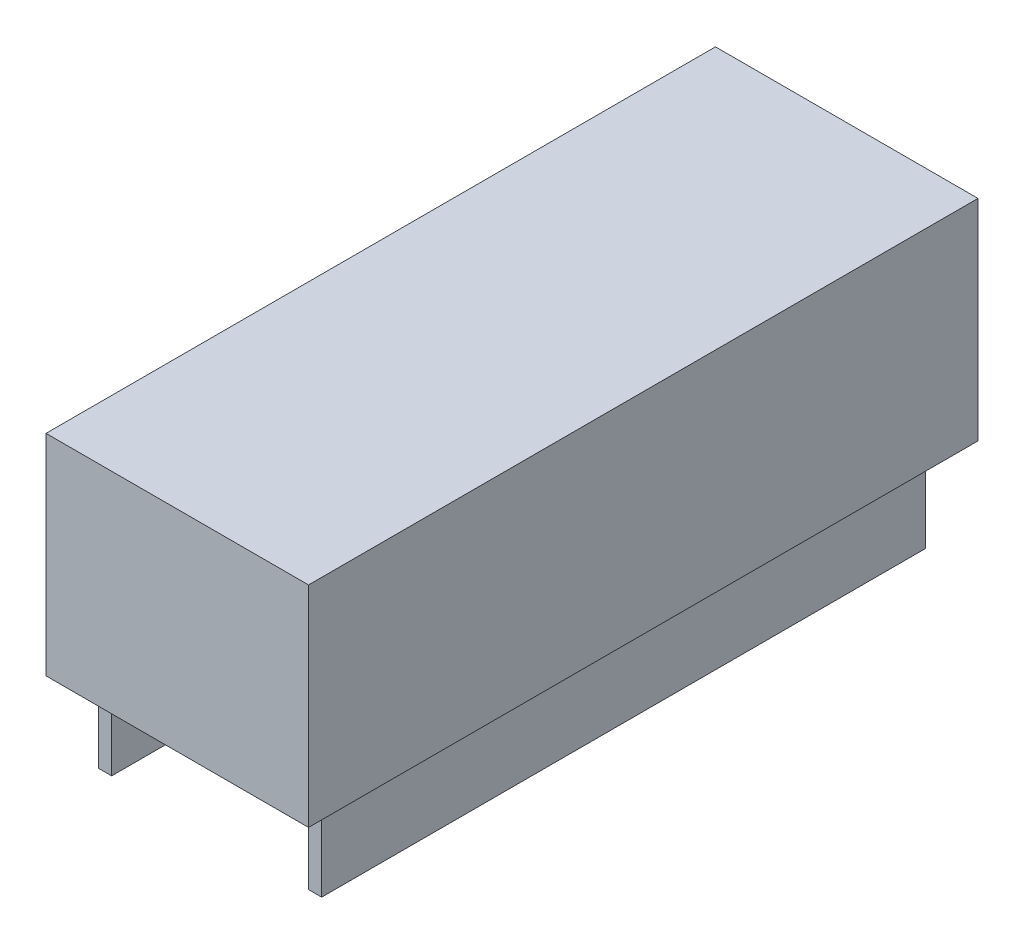
ISO-10303-21;
HEADER;
FILE_DESCRIPTION(('STEP AP214'),'2;1');
FILE_NAME('part.step','',(''),(''),'','','');
FILE_SCHEMA(('AUTOMOTIVE_DESIGN { 1 0 10303 214 1 1 1 1 }'));
ENDSEC;
DATA;
#1=APPLICATION_CONTEXT('core data for automotive mechanical design processes');
#2=APPLICATION_PROTOCOL_DEFINITION('international standard','automotive_design',2000,#1);
#3=PRODUCT_CONTEXT('',#1,'mechanical');
#4=PRODUCT('Part','Part','',(#3));
#5=PRODUCT_RELATED_PRODUCT_CATEGORY('part','',(#4));
#6=PRODUCT_DEFINITION_FORMATION('','',#4);
#7=PRODUCT_DEFINITION_CONTEXT('part definition',#1,'design');
#8=PRODUCT_DEFINITION('design','',#6,#7);
#9=PRODUCT_DEFINITION_SHAPE('','',#8);
#10=(LENGTH_UNIT() NAMED_UNIT(*) SI_UNIT(.MILLI.,.METRE.));
#11=(NAMED_UNIT(*) PLANE_ANGLE_UNIT() SI_UNIT($,.RADIAN.));
#12=(NAMED_UNIT(*) SI_UNIT($,.STERADIAN.) SOLID_ANGLE_UNIT());
#13=UNCERTAINTY_MEASURE_WITH_UNIT(LENGTH_MEASURE(1.E-05),#10,'distance_accuracy_value','');
#14=(GEOMETRIC_REPRESENTATION_CONTEXT(3) GLOBAL_UNCERTAINTY_ASSIGNED_CONTEXT((#13)) GLOBAL_UNIT_ASSIGNED_CONTEXT((#10,
#11,#12)) REPRESENTATION_CONTEXT('',''));
#15=CARTESIAN_POINT('',(0.,0.,0.));
#16=DIRECTION('',(0.,0.,1.));
#17=DIRECTION('',(1.,0.,0.));
#18=AXIS2_PLACEMENT_3D('',#15,#16,#17);
#19=CARTESIAN_POINT('',(0.,-8.,0.));
#20=DIRECTION('',(0.,-1.,0.));
#21=DIRECTION('',(0.,0.,-1.));
#22=AXIS2_PLACEMENT_3D('',#19,#20,#21);
#23=PLANE('',#22);
#24=DIRECTION('',(0.,0.,-1.));
#25=VECTOR('',#24,1.);
#26=CARTESIAN_POINT('',(5.,-8.,12.75));
#27=LINE('',#26,#25);
#28=CARTESIAN_POINT('',(5.,-8.,12.75));
#29=VERTEX_POINT('',#28);
#30=CARTESIAN_POINT('',(5.,-8.,-12.75));
#31=VERTEX_POINT('',#30);
#32=EDGE_CURVE('E181',#29,#31,#27,.T.);
#33=ORIENTED_EDGE('',*,*,#32,.F.);
#34=DIRECTION('',(1.,0.,0.));
#35=VECTOR('',#34,1.);
#36=CARTESIAN_POINT('',(-5.,-8.,12.75));
#37=LINE('',#36,#35);
#38=CARTESIAN_POINT('',(-5.,-8.,12.75));
#39=VERTEX_POINT('',#38);
#40=EDGE_CURVE('E191',#39,#29,#37,.T.);
#41=ORIENTED_EDGE('',*,*,#40,.F.);
#42=DIRECTION('',(0.,0.,1.));
#43=VECTOR('',#42,1.);
#44=CARTESIAN_POINT('',(-5.,-8.,12.75));
#45=LINE('',#44,#43);
#46=CARTESIAN_POINT('',(-5.,-8.,-12.75));
#47=VERTEX_POINT('',#46);
#48=EDGE_CURVE('E188',#47,#39,#45,.T.);
#49=ORIENTED_EDGE('',*,*,#48,.F.);
#50=DIRECTION('',(-1.,0.,0.));
#51=VECTOR('',#50,1.);
#52=CARTESIAN_POINT('',(-5.,-8.,-12.75));
#53=LINE('',#52,#51);
#54=EDGE_CURVE('E184',#31,#47,#53,.T.);
#55=ORIENTED_EDGE('',*,*,#54,.F.);
#56=EDGE_LOOP('',(#33,#41,#49,#55));
#57=FACE_BOUND('',#56,.T.);
#58=DIRECTION('',(1.,0.,0.));
#59=VECTOR('',#58,1.);
#60=CARTESIAN_POINT('',(4.25,-8.,-11.5));
#61=LINE('',#60,#59);
#62=CARTESIAN_POINT('',(3.75,-8.,-11.5));
#63=VERTEX_POINT('',#62);
#64=CARTESIAN_POINT('',(4.25,-8.,-11.5));
#65=VERTEX_POINT('',#64);
#66=EDGE_CURVE('E152',#63,#65,#61,.T.);
#67=ORIENTED_EDGE('',*,*,#66,.F.);
#68=DIRECTION('',(0.,0.,-1.));
#69=VECTOR('',#68,1.);
#70=CARTESIAN_POINT('',(3.75,-8.,11.5));
#71=LINE('',#70,#69);
#72=CARTESIAN_POINT('',(3.75,-8.,11.5));
#73=VERTEX_POINT('',#72);
#74=EDGE_CURVE('E149',#73,#63,#71,.T.);
#75=ORIENTED_EDGE('',*,*,#74,.F.);
#76=DIRECTION('',(-1.,0.,0.));
#77=VECTOR('',#76,1.);
#78=CARTESIAN_POINT('',(4.25,-8.,11.5));
#79=LINE('',#78,#77);
#80=CARTESIAN_POINT('',(4.25,-8.,11.5));
#81=VERTEX_POINT('',#80);
#82=EDGE_CURVE('E161',#81,#73,#79,.T.);
#83=ORIENTED_EDGE('',*,*,#82,.F.);
#84=DIRECTION('',(0.,0.,1.));
#85=VECTOR('',#84,1.);
#86=CARTESIAN_POINT('',(4.25,-8.,11.5));
#87=LINE('',#86,#85);
#88=EDGE_CURVE('E169',#65,#81,#87,.T.);
#89=ORIENTED_EDGE('',*,*,#88,.F.);
#90=EDGE_LOOP('',(#67,#75,#83,#89));
#91=FACE_BOUND('',#90,.T.);
#92=DIRECTION('',(1.,0.,0.));
#93=VECTOR('',#92,1.);
#94=CARTESIAN_POINT('',(-4.25,-8.,-11.5));
#95=LINE('',#94,#93);
#96=CARTESIAN_POINT('',(-4.25,-8.,-11.5));
#97=VERTEX_POINT('',#96);
#98=CARTESIAN_POINT('',(-3.75,-8.,-11.5));
#99=VERTEX_POINT('',#98);
#100=EDGE_CURVE('E378',#97,#99,#95,.T.);
#101=ORIENTED_EDGE('',*,*,#100,.F.);
#102=DIRECTION('',(0.,0.,-1.));
#103=VECTOR('',#102,1.);
#104=CARTESIAN_POINT('',(-4.25,-8.,11.5));
#105=LINE('',#104,#103);
#106=CARTESIAN_POINT('',(-4.25,-8.,11.5));
#107=VERTEX_POINT('',#106);
#108=EDGE_CURVE('E147',#107,#97,#105,.T.);
#109=ORIENTED_EDGE('',*,*,#108,.F.);
#110=DIRECTION('',(-1.,0.,0.));
#111=VECTOR('',#110,1.);
#112=CARTESIAN_POINT('',(-4.25,-8.,11.5));
#113=LINE('',#112,#111);
#114=CARTESIAN_POINT('',(-3.75,-8.,11.5));
#115=VERTEX_POINT('',#114);
#116=EDGE_CURVE('E143',#115,#107,#113,.T.);
#117=ORIENTED_EDGE('',*,*,#116,.F.);
#118=DIRECTION('',(0.,0.,1.));
#119=VECTOR('',#118,1.);
#120=CARTESIAN_POINT('',(-3.75,-8.,11.5));
#121=LINE('',#120,#119);
#122=EDGE_CURVE('E375',#99,#115,#121,.T.);
#123=ORIENTED_EDGE('',*,*,#122,.F.);
#124=EDGE_LOOP('',(#101,#109,#117,#123));
#125=FACE_BOUND('',#124,.T.);
#126=ADVANCED_FACE('F33',(#57,#91,#125),#23,.T.);
#127=CARTESIAN_POINT('',(5.,-8.,12.75));
#128=DIRECTION('',(1.,0.,0.));
#129=DIRECTION('',(0.,0.,-1.));
#130=AXIS2_PLACEMENT_3D('',#127,#128,#129);
#131=PLANE('',#130);
#132=DIRECTION('',(0.,0.,-1.));
#133=VECTOR('',#132,1.);
#134=CARTESIAN_POINT('',(5.,0.,12.75));
#135=LINE('',#134,#133);
#136=CARTESIAN_POINT('',(5.,0.,12.75));
#137=VERTEX_POINT('',#136);
#138=CARTESIAN_POINT('',(5.,0.,-12.75));
#139=VERTEX_POINT('',#138);
#140=EDGE_CURVE('E180',#137,#139,#135,.T.);
#141=ORIENTED_EDGE('',*,*,#140,.F.);
#142=DIRECTION('',(0.,1.,0.));
#143=VECTOR('',#142,1.);
#144=CARTESIAN_POINT('',(5.,-8.,12.75));
#145=LINE('',#144,#143);
#146=EDGE_CURVE('E11',#29,#137,#145,.T.);
#147=ORIENTED_EDGE('',*,*,#146,.F.);
#148=ORIENTED_EDGE('',*,*,#32,.T.);
#149=DIRECTION('',(0.,1.,0.));
#150=VECTOR('',#149,1.);
#151=CARTESIAN_POINT('',(5.,-8.,-12.75));
#152=LINE('',#151,#150);
#153=EDGE_CURVE('E37',#31,#139,#152,.T.);
#154=ORIENTED_EDGE('',*,*,#153,.T.);
#155=EDGE_LOOP('',(#141,#147,#148,#154));
#156=FACE_BOUND('',#155,.T.);
#157=ADVANCED_FACE('F35',(#156),#131,.T.);
#158=CARTESIAN_POINT('',(-5.,-8.,12.75));
#159=DIRECTION('',(0.,0.,1.));
#160=DIRECTION('',(1.,0.,0.));
#161=AXIS2_PLACEMENT_3D('',#158,#159,#160);
#162=PLANE('',#161);
#163=DIRECTION('',(1.,0.,0.));
#164=VECTOR('',#163,1.);
#165=CARTESIAN_POINT('',(-5.,0.,12.75));
#166=LINE('',#165,#164);
#167=CARTESIAN_POINT('',(-5.,0.,12.75));
#168=VERTEX_POINT('',#167);
#169=EDGE_CURVE('E185',#168,#137,#166,.T.);
#170=ORIENTED_EDGE('',*,*,#169,.F.);
#171=DIRECTION('',(0.,1.,0.));
#172=VECTOR('',#171,1.);
#173=CARTESIAN_POINT('',(-5.,-8.,12.75));
#174=LINE('',#173,#172);
#175=EDGE_CURVE('E42',#39,#168,#174,.T.);
#176=ORIENTED_EDGE('',*,*,#175,.F.);
#177=ORIENTED_EDGE('',*,*,#40,.T.);
#178=ORIENTED_EDGE('',*,*,#146,.T.);
#179=EDGE_LOOP('',(#170,#176,#177,#178));
#180=FACE_BOUND('',#179,.T.);
#181=ADVANCED_FACE('F217',(#180),#162,.T.);
#182=CARTESIAN_POINT('',(-5.,-8.,12.75));
#183=DIRECTION('',(-1.,0.,0.));
#184=DIRECTION('',(0.,0.,1.));
#185=AXIS2_PLACEMENT_3D('',#182,#183,#184);
#186=PLANE('',#185);
#187=DIRECTION('',(0.,0.,1.));
#188=VECTOR('',#187,1.);
#189=CARTESIAN_POINT('',(-5.,0.,12.75));
#190=LINE('',#189,#188);
#191=CARTESIAN_POINT('',(-5.,0.,-12.75));
#192=VERTEX_POINT('',#191);
#193=EDGE_CURVE('E199',#192,#168,#190,.T.);
#194=ORIENTED_EDGE('',*,*,#193,.F.);
#195=DIRECTION('',(0.,1.,0.));
#196=VECTOR('',#195,1.);
#197=CARTESIAN_POINT('',(-5.,-8.,-12.75));
#198=LINE('',#197,#196);
#199=EDGE_CURVE('E204',#47,#192,#198,.T.);
#200=ORIENTED_EDGE('',*,*,#199,.F.);
#201=ORIENTED_EDGE('',*,*,#48,.T.);
#202=ORIENTED_EDGE('',*,*,#175,.T.);
#203=EDGE_LOOP('',(#194,#200,#201,#202));
#204=FACE_BOUND('',#203,.T.);
#205=ADVANCED_FACE('F223',(#204),#186,.T.);
#206=CARTESIAN_POINT('',(-5.,-8.,-12.75));
#207=DIRECTION('',(0.,0.,-1.));
#208=DIRECTION('',(-1.,0.,0.));
#209=AXIS2_PLACEMENT_3D('',#206,#207,#208);
#210=PLANE('',#209);
#211=DIRECTION('',(-1.,0.,0.));
#212=VECTOR('',#211,1.);
#213=CARTESIAN_POINT('',(-5.,0.,-12.75));
#214=LINE('',#213,#212);
#215=EDGE_CURVE('E196',#139,#192,#214,.T.);
#216=ORIENTED_EDGE('',*,*,#215,.F.);
#217=ORIENTED_EDGE('',*,*,#153,.F.);
#218=ORIENTED_EDGE('',*,*,#54,.T.);
#219=ORIENTED_EDGE('',*,*,#199,.T.);
#220=EDGE_LOOP('',(#216,#217,#218,#219));
#221=FACE_BOUND('',#220,.T.);
#222=ADVANCED_FACE('F212',(#221),#210,.T.);
#223=CARTESIAN_POINT('',(0.,0.,0.));
#224=DIRECTION('',(0.,-1.,0.));
#225=DIRECTION('',(0.,0.,-1.));
#226=AXIS2_PLACEMENT_3D('',#223,#224,#225);
#227=PLANE('',#226);
#228=ORIENTED_EDGE('',*,*,#140,.T.);
#229=ORIENTED_EDGE('',*,*,#215,.T.);
#230=ORIENTED_EDGE('',*,*,#193,.T.);
#231=ORIENTED_EDGE('',*,*,#169,.T.);
#232=EDGE_LOOP('',(#228,#229,#230,#231));
#233=FACE_BOUND('',#232,.T.);
#234=ADVANCED_FACE('F214',(#233),#227,.F.);
#235=CARTESIAN_POINT('',(3.75,-11.3,11.5));
#236=DIRECTION('',(1.,0.,0.));
#237=DIRECTION('',(0.,0.,-1.));
#238=AXIS2_PLACEMENT_3D('',#235,#236,#237);
#239=PLANE('',#238);
#240=ORIENTED_EDGE('',*,*,#74,.T.);
#241=DIRECTION('',(0.,1.,0.));
#242=VECTOR('',#241,1.);
#243=CARTESIAN_POINT('',(3.75,-11.3,-11.5));
#244=LINE('',#243,#242);
#245=CARTESIAN_POINT('',(3.75,-11.3,-11.5));
#246=VERTEX_POINT('',#245);
#247=EDGE_CURVE('E178',#246,#63,#244,.T.);
#248=ORIENTED_EDGE('',*,*,#247,.F.);
#249=DIRECTION('',(0.,0.,-1.));
#250=VECTOR('',#249,1.);
#251=CARTESIAN_POINT('',(3.75,-11.3,11.5));
#252=LINE('',#251,#250);
#253=CARTESIAN_POINT('',(3.75,-11.3,11.5));
#254=VERTEX_POINT('',#253);
#255=EDGE_CURVE('E157',#254,#246,#252,.T.);
#256=ORIENTED_EDGE('',*,*,#255,.F.);
#257=DIRECTION('',(0.,1.,0.));
#258=VECTOR('',#257,1.);
#259=CARTESIAN_POINT('',(3.75,-11.3,11.5));
#260=LINE('',#259,#258);
#261=EDGE_CURVE('E166',#254,#73,#260,.T.);
#262=ORIENTED_EDGE('',*,*,#261,.T.);
#263=EDGE_LOOP('',(#240,#248,#256,#262));
#264=FACE_BOUND('',#263,.T.);
#265=ADVANCED_FACE('F238',(#264),#239,.F.);
#266=CARTESIAN_POINT('',(4.25,-11.3,-11.5));
#267=DIRECTION('',(0.,0.,1.));
#268=DIRECTION('',(1.,0.,0.));
#269=AXIS2_PLACEMENT_3D('',#266,#267,#268);
#270=PLANE('',#269);
#271=ORIENTED_EDGE('',*,*,#66,.T.);
#272=DIRECTION('',(0.,1.,0.));
#273=VECTOR('',#272,1.);
#274=CARTESIAN_POINT('',(4.25,-11.3,-11.5));
#275=LINE('',#274,#273);
#276=CARTESIAN_POINT('',(4.25,-11.3,-11.5));
#277=VERTEX_POINT('',#276);
#278=EDGE_CURVE('E175',#277,#65,#275,.T.);
#279=ORIENTED_EDGE('',*,*,#278,.F.);
#280=DIRECTION('',(1.,0.,0.));
#281=VECTOR('',#280,1.);
#282=CARTESIAN_POINT('',(4.25,-11.3,-11.5));
#283=LINE('',#282,#281);
#284=EDGE_CURVE('E160',#246,#277,#283,.T.);
#285=ORIENTED_EDGE('',*,*,#284,.F.);
#286=ORIENTED_EDGE('',*,*,#247,.T.);
#287=EDGE_LOOP('',(#271,#279,#285,#286));
#288=FACE_BOUND('',#287,.T.);
#289=ADVANCED_FACE('F244',(#288),#270,.F.);
#290=CARTESIAN_POINT('',(4.25,-11.3,11.5));
#291=DIRECTION('',(-1.,0.,0.));
#292=DIRECTION('',(0.,0.,1.));
#293=AXIS2_PLACEMENT_3D('',#290,#291,#292);
#294=PLANE('',#293);
#295=ORIENTED_EDGE('',*,*,#88,.T.);
#296=DIRECTION('',(0.,1.,0.));
#297=VECTOR('',#296,1.);
#298=CARTESIAN_POINT('',(4.25,-11.3,11.5));
#299=LINE('',#298,#297);
#300=CARTESIAN_POINT('',(4.25,-11.3,11.5));
#301=VERTEX_POINT('',#300);
#302=EDGE_CURVE('E58',#301,#81,#299,.T.);
#303=ORIENTED_EDGE('',*,*,#302,.F.);
#304=DIRECTION('',(0.,0.,1.));
#305=VECTOR('',#304,1.);
#306=CARTESIAN_POINT('',(4.25,-11.3,11.5));
#307=LINE('',#306,#305);
#308=EDGE_CURVE('E163',#277,#301,#307,.T.);
#309=ORIENTED_EDGE('',*,*,#308,.F.);
#310=ORIENTED_EDGE('',*,*,#278,.T.);
#311=EDGE_LOOP('',(#295,#303,#309,#310));
#312=FACE_BOUND('',#311,.T.);
#313=ADVANCED_FACE('F249',(#312),#294,.F.);
#314=CARTESIAN_POINT('',(4.25,-11.3,11.5));
#315=DIRECTION('',(0.,0.,-1.));
#316=DIRECTION('',(-1.,0.,0.));
#317=AXIS2_PLACEMENT_3D('',#314,#315,#316);
#318=PLANE('',#317);
#319=ORIENTED_EDGE('',*,*,#82,.T.);
#320=ORIENTED_EDGE('',*,*,#261,.F.);
#321=DIRECTION('',(-1.,0.,0.));
#322=VECTOR('',#321,1.);
#323=CARTESIAN_POINT('',(4.25,-11.3,11.5));
#324=LINE('',#323,#322);
#325=EDGE_CURVE('E165',#301,#254,#324,.T.);
#326=ORIENTED_EDGE('',*,*,#325,.F.);
#327=ORIENTED_EDGE('',*,*,#302,.T.);
#328=EDGE_LOOP('',(#319,#320,#326,#327));
#329=FACE_BOUND('',#328,.T.);
#330=ADVANCED_FACE('F264',(#329),#318,.F.);
#331=CARTESIAN_POINT('',(0.,-11.3,0.));
#332=DIRECTION('',(0.,1.,0.));
#333=DIRECTION('',(0.,0.,1.));
#334=AXIS2_PLACEMENT_3D('',#331,#332,#333);
#335=PLANE('',#334);
#336=ORIENTED_EDGE('',*,*,#255,.T.);
#337=ORIENTED_EDGE('',*,*,#284,.T.);
#338=ORIENTED_EDGE('',*,*,#308,.T.);
#339=ORIENTED_EDGE('',*,*,#325,.T.);
#340=EDGE_LOOP('',(#336,#337,#338,#339));
#341=FACE_BOUND('',#340,.T.);
#342=ADVANCED_FACE('F263',(#341),#335,.F.);
#343=CARTESIAN_POINT('',(-4.25,-11.3,11.5));
#344=DIRECTION('',(1.,0.,0.));
#345=DIRECTION('',(0.,0.,-1.));
#346=AXIS2_PLACEMENT_3D('',#343,#344,#345);
#347=PLANE('',#346);
#348=ORIENTED_EDGE('',*,*,#108,.T.);
#349=DIRECTION('',(0.,1.,0.));
#350=VECTOR('',#349,1.);
#351=CARTESIAN_POINT('',(-4.25,-11.3,-11.5));
#352=LINE('',#351,#350);
#353=CARTESIAN_POINT('',(-4.25,-11.3,-11.5));
#354=VERTEX_POINT('',#353);
#355=EDGE_CURVE('E128',#354,#97,#352,.T.);
#356=ORIENTED_EDGE('',*,*,#355,.F.);
#357=DIRECTION('',(0.,0.,-1.));
#358=VECTOR('',#357,1.);
#359=CARTESIAN_POINT('',(-4.25,-11.3,11.5));
#360=LINE('',#359,#358);
#361=CARTESIAN_POINT('',(-4.25,-11.3,11.5));
#362=VERTEX_POINT('',#361);
#363=EDGE_CURVE('E135',#362,#354,#360,.T.);
#364=ORIENTED_EDGE('',*,*,#363,.F.);
#365=DIRECTION('',(0.,1.,0.));
#366=VECTOR('',#365,1.);
#367=CARTESIAN_POINT('',(-4.25,-11.3,11.5));
#368=LINE('',#367,#366);
#369=EDGE_CURVE('E373',#362,#107,#368,.T.);
#370=ORIENTED_EDGE('',*,*,#369,.T.);
#371=EDGE_LOOP('',(#348,#356,#364,#370));
#372=FACE_BOUND('',#371,.T.);
#373=ADVANCED_FACE('F145',(#372),#347,.F.);
#374=CARTESIAN_POINT('',(-4.25,-11.3,-11.5));
#375=DIRECTION('',(0.,0.,1.));
#376=DIRECTION('',(1.,0.,0.));
#377=AXIS2_PLACEMENT_3D('',#374,#375,#376);
#378=PLANE('',#377);
#379=ORIENTED_EDGE('',*,*,#100,.T.);
#380=DIRECTION('',(0.,1.,0.));
#381=VECTOR('',#380,1.);
#382=CARTESIAN_POINT('',(-3.75,-11.3,-11.5));
#383=LINE('',#382,#381);
#384=CARTESIAN_POINT('',(-3.75,-11.3,-11.5));
#385=VERTEX_POINT('',#384);
#386=EDGE_CURVE('E131',#385,#99,#383,.T.);
#387=ORIENTED_EDGE('',*,*,#386,.F.);
#388=DIRECTION('',(1.,0.,0.));
#389=VECTOR('',#388,1.);
#390=CARTESIAN_POINT('',(-4.25,-11.3,-11.5));
#391=LINE('',#390,#389);
#392=EDGE_CURVE('E124',#354,#385,#391,.T.);
#393=ORIENTED_EDGE('',*,*,#392,.F.);
#394=ORIENTED_EDGE('',*,*,#355,.T.);
#395=EDGE_LOOP('',(#379,#387,#393,#394));
#396=FACE_BOUND('',#395,.T.);
#397=ADVANCED_FACE('F126',(#396),#378,.F.);
#398=CARTESIAN_POINT('',(-3.75,-11.3,11.5));
#399=DIRECTION('',(-1.,0.,0.));
#400=DIRECTION('',(0.,0.,1.));
#401=AXIS2_PLACEMENT_3D('',#398,#399,#400);
#402=PLANE('',#401);
#403=ORIENTED_EDGE('',*,*,#122,.T.);
#404=DIRECTION('',(0.,1.,0.));
#405=VECTOR('',#404,1.);
#406=CARTESIAN_POINT('',(-3.75,-11.3,11.5));
#407=LINE('',#406,#405);
#408=CARTESIAN_POINT('',(-3.75,-11.3,11.5));
#409=VERTEX_POINT('',#408);
#410=EDGE_CURVE('E50',#409,#115,#407,.T.);
#411=ORIENTED_EDGE('',*,*,#410,.F.);
#412=DIRECTION('',(0.,0.,1.));
#413=VECTOR('',#412,1.);
#414=CARTESIAN_POINT('',(-3.75,-11.3,11.5));
#415=LINE('',#414,#413);
#416=EDGE_CURVE('E134',#385,#409,#415,.T.);
#417=ORIENTED_EDGE('',*,*,#416,.F.);
#418=ORIENTED_EDGE('',*,*,#386,.T.);
#419=EDGE_LOOP('',(#403,#411,#417,#418));
#420=FACE_BOUND('',#419,.T.);
#421=ADVANCED_FACE('F278',(#420),#402,.F.);
#422=CARTESIAN_POINT('',(-4.25,-11.3,11.5));
#423=DIRECTION('',(0.,0.,-1.));
#424=DIRECTION('',(-1.,0.,0.));
#425=AXIS2_PLACEMENT_3D('',#422,#423,#424);
#426=PLANE('',#425);
#427=ORIENTED_EDGE('',*,*,#116,.T.);
#428=ORIENTED_EDGE('',*,*,#369,.F.);
#429=DIRECTION('',(-1.,0.,0.));
#430=VECTOR('',#429,1.);
#431=CARTESIAN_POINT('',(-4.25,-11.3,11.5));
#432=LINE('',#431,#430);
#433=EDGE_CURVE('E139',#409,#362,#432,.T.);
#434=ORIENTED_EDGE('',*,*,#433,.F.);
#435=ORIENTED_EDGE('',*,*,#410,.T.);
#436=EDGE_LOOP('',(#427,#428,#434,#435));
#437=FACE_BOUND('',#436,.T.);
#438=ADVANCED_FACE('F281',(#437),#426,.F.);
#439=CARTESIAN_POINT('',(0.,-11.3,0.));
#440=DIRECTION('',(0.,-1.,0.));
#441=DIRECTION('',(0.,0.,-1.));
#442=AXIS2_PLACEMENT_3D('',#439,#440,#441);
#443=PLANE('',#442);
#444=ORIENTED_EDGE('',*,*,#363,.T.);
#445=ORIENTED_EDGE('',*,*,#392,.T.);
#446=ORIENTED_EDGE('',*,*,#416,.T.);
#447=ORIENTED_EDGE('',*,*,#433,.T.);
#448=EDGE_LOOP('',(#444,#445,#446,#447));
#449=FACE_BOUND('',#448,.T.);
#450=ADVANCED_FACE('F138',(#449),#443,.T.);
#451=CLOSED_SHELL('',(#126,#157,#181,#205,#222,#234,#265,#289,#313,#330,#342,#373,#397,#421,
#438,#450));
#452=MANIFOLD_SOLID_BREP('B2',#451);
#453=ADVANCED_BREP_SHAPE_REPRESENTATION('',(#18,#452),#14);
#454=SHAPE_DEFINITION_REPRESENTATION(#9,#453);
ENDSEC;
END-ISO-10303-21;
